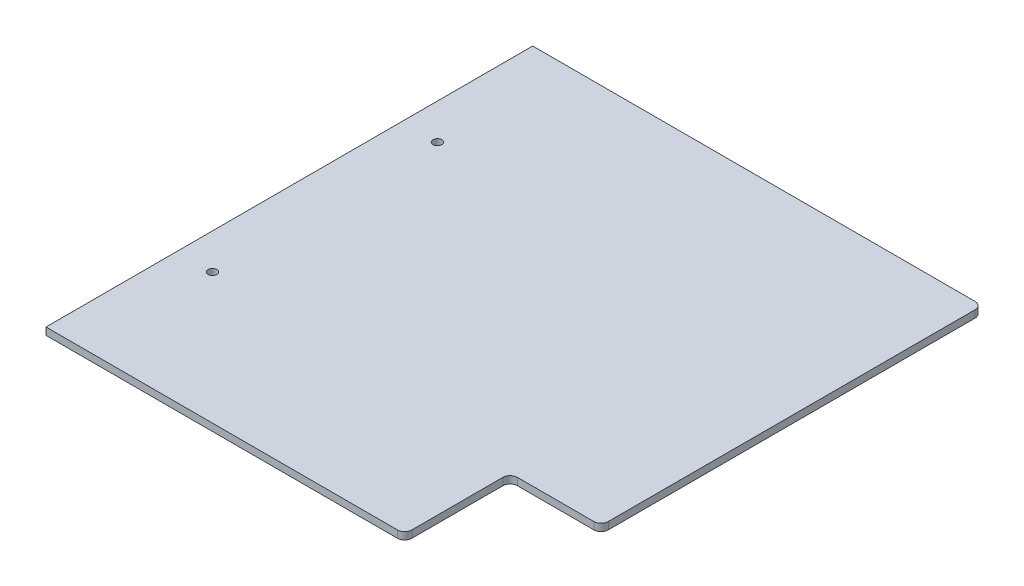
ISO-10303-21;
HEADER;
FILE_DESCRIPTION(('STEP AP214'),'2;1');
FILE_NAME('part.step','',(''),(''),'','','');
FILE_SCHEMA(('AUTOMOTIVE_DESIGN { 1 0 10303 214 1 1 1 1 }'));
ENDSEC;
DATA;
#1=APPLICATION_CONTEXT('core data for automotive mechanical design processes');
#2=APPLICATION_PROTOCOL_DEFINITION('international standard','automotive_design',2000,#1);
#3=PRODUCT_CONTEXT('',#1,'mechanical');
#4=PRODUCT('Part','Part','',(#3));
#5=PRODUCT_RELATED_PRODUCT_CATEGORY('part','',(#4));
#6=PRODUCT_DEFINITION_FORMATION('','',#4);
#7=PRODUCT_DEFINITION_CONTEXT('part definition',#1,'design');
#8=PRODUCT_DEFINITION('design','',#6,#7);
#9=PRODUCT_DEFINITION_SHAPE('','',#8);
#10=(LENGTH_UNIT() NAMED_UNIT(*) SI_UNIT(.MILLI.,.METRE.));
#11=(NAMED_UNIT(*) PLANE_ANGLE_UNIT() SI_UNIT($,.RADIAN.));
#12=(NAMED_UNIT(*) SI_UNIT($,.STERADIAN.) SOLID_ANGLE_UNIT());
#13=UNCERTAINTY_MEASURE_WITH_UNIT(LENGTH_MEASURE(1.E-05),#10,'distance_accuracy_value','');
#14=(GEOMETRIC_REPRESENTATION_CONTEXT(3) GLOBAL_UNCERTAINTY_ASSIGNED_CONTEXT((#13)) GLOBAL_UNIT_ASSIGNED_CONTEXT((#10,
#11,#12)) REPRESENTATION_CONTEXT('',''));
#15=CARTESIAN_POINT('',(0.,0.,0.));
#16=DIRECTION('',(0.,0.,1.));
#17=DIRECTION('',(1.,0.,0.));
#18=AXIS2_PLACEMENT_3D('',#15,#16,#17);
#19=CARTESIAN_POINT('',(0.,5.,0.));
#20=DIRECTION('',(0.,-1.,0.));
#21=DIRECTION('',(0.,0.,-1.));
#22=AXIS2_PLACEMENT_3D('',#19,#20,#21);
#23=PLANE('',#22);
#24=CARTESIAN_POINT('',(-93.2768482490273,5.,-44.9280155642024));
#25=DIRECTION('',(0.,1.,0.));
#26=DIRECTION('',(0.,0.,1.));
#27=AXIS2_PLACEMENT_3D('',#24,#25,#26);
#28=CIRCLE('',#27,3.00000000000001);
#29=CARTESIAN_POINT('',(-93.2768482490273,5.,-41.9280155642024));
#30=VERTEX_POINT('',#29);
#31=EDGE_CURVE('E148',#30,#30,#28,.T.);
#32=ORIENTED_EDGE('',*,*,#31,.F.);
#33=EDGE_LOOP('',(#32));
#34=FACE_BOUND('',#33,.T.);
#35=DIRECTION('',(1.,0.,0.));
#36=VECTOR('',#35,1.);
#37=CARTESIAN_POINT('',(-117.776848249027,5.,199.571984435798));
#38=LINE('',#37,#36);
#39=CARTESIAN_POINT('',(-117.776848249027,5.,199.571984435798));
#40=VERTEX_POINT('',#39);
#41=CARTESIAN_POINT('',(123.723151750973,5.,199.571984435798));
#42=VERTEX_POINT('',#41);
#43=EDGE_CURVE('E136',#40,#42,#38,.T.);
#44=ORIENTED_EDGE('',*,*,#43,.T.);
#45=CARTESIAN_POINT('',(123.723151750973,5.,194.571984435798));
#46=DIRECTION('',(0.,-1.,0.));
#47=DIRECTION('',(0.,0.,-1.));
#48=AXIS2_PLACEMENT_3D('',#45,#46,#47);
#49=CIRCLE('',#48,5.);
#50=CARTESIAN_POINT('',(128.723151750973,5.,194.571984435798));
#51=VERTEX_POINT('',#50);
#52=EDGE_CURVE('E176',#42,#51,#49,.F.);
#53=ORIENTED_EDGE('',*,*,#52,.T.);
#54=DIRECTION('',(0.,0.,-1.));
#55=VECTOR('',#54,1.);
#56=CARTESIAN_POINT('',(128.723151750973,5.,127.071984435798));
#57=LINE('',#56,#55);
#58=CARTESIAN_POINT('',(128.723151750973,5.,132.071984435798));
#59=VERTEX_POINT('',#58);
#60=EDGE_CURVE('E138',#51,#59,#57,.T.);
#61=ORIENTED_EDGE('',*,*,#60,.T.);
#62=CARTESIAN_POINT('',(133.723151750973,5.,132.071984435798));
#63=DIRECTION('',(0.,-1.,0.));
#64=DIRECTION('',(0.,0.,-1.));
#65=AXIS2_PLACEMENT_3D('',#62,#63,#64);
#66=CIRCLE('',#65,5.);
#67=CARTESIAN_POINT('',(133.723151750973,5.,127.071984435798));
#68=VERTEX_POINT('',#67);
#69=EDGE_CURVE('E11',#59,#68,#66,.T.);
#70=ORIENTED_EDGE('',*,*,#69,.T.);
#71=DIRECTION('',(1.,0.,0.));
#72=VECTOR('',#71,1.);
#73=CARTESIAN_POINT('',(191.223151750973,5.,127.071984435798));
#74=LINE('',#73,#72);
#75=CARTESIAN_POINT('',(186.223151750973,5.,127.071984435798));
#76=VERTEX_POINT('',#75);
#77=EDGE_CURVE('E143',#68,#76,#74,.T.);
#78=ORIENTED_EDGE('',*,*,#77,.T.);
#79=CARTESIAN_POINT('',(186.223151750973,5.,122.071984435798));
#80=DIRECTION('',(0.,-1.,0.));
#81=DIRECTION('',(0.,0.,-1.));
#82=AXIS2_PLACEMENT_3D('',#79,#80,#81);
#83=CIRCLE('',#82,5.);
#84=CARTESIAN_POINT('',(191.223151750973,5.,122.071984435798));
#85=VERTEX_POINT('',#84);
#86=EDGE_CURVE('E174',#76,#85,#83,.F.);
#87=ORIENTED_EDGE('',*,*,#86,.T.);
#88=DIRECTION('',(0.,0.,-1.));
#89=VECTOR('',#88,1.);
#90=CARTESIAN_POINT('',(191.223151750973,5.,127.071984435798));
#91=LINE('',#90,#89);
#92=CARTESIAN_POINT('',(191.223151750973,5.,-129.928015564202));
#93=VERTEX_POINT('',#92);
#94=EDGE_CURVE('E121',#85,#93,#91,.T.);
#95=ORIENTED_EDGE('',*,*,#94,.T.);
#96=CARTESIAN_POINT('',(186.223151750973,5.,-129.928015564202));
#97=DIRECTION('',(0.,-1.,0.));
#98=DIRECTION('',(0.,0.,-1.));
#99=AXIS2_PLACEMENT_3D('',#96,#97,#98);
#100=CIRCLE('',#99,5.);
#101=CARTESIAN_POINT('',(186.223151750973,5.,-134.928015564202));
#102=VERTEX_POINT('',#101);
#103=EDGE_CURVE('E117',#93,#102,#100,.F.);
#104=ORIENTED_EDGE('',*,*,#103,.T.);
#105=DIRECTION('',(-1.,0.,0.));
#106=VECTOR('',#105,1.);
#107=CARTESIAN_POINT('',(-117.776848249027,5.,-134.928015564202));
#108=LINE('',#107,#106);
#109=CARTESIAN_POINT('',(-117.776848249027,5.,-134.928015564202));
#110=VERTEX_POINT('',#109);
#111=EDGE_CURVE('E108',#102,#110,#108,.T.);
#112=ORIENTED_EDGE('',*,*,#111,.T.);
#113=DIRECTION('',(0.,0.,1.));
#114=VECTOR('',#113,1.);
#115=CARTESIAN_POINT('',(-117.776848249027,5.,199.571984435798));
#116=LINE('',#115,#114);
#117=EDGE_CURVE('E113',#110,#40,#116,.T.);
#118=ORIENTED_EDGE('',*,*,#117,.T.);
#119=EDGE_LOOP('',(#44,#53,#61,#70,#78,#87,#95,#104,#112,#118));
#120=FACE_BOUND('',#119,.T.);
#121=CARTESIAN_POINT('',(-93.2768482490273,5.,109.571984435798));
#122=DIRECTION('',(0.,1.,0.));
#123=DIRECTION('',(0.,0.,1.));
#124=AXIS2_PLACEMENT_3D('',#121,#122,#123);
#125=CIRCLE('',#124,3.00000000000001);
#126=CARTESIAN_POINT('',(-93.2768482490273,5.,112.571984435798));
#127=VERTEX_POINT('',#126);
#128=EDGE_CURVE('E216',#127,#127,#125,.T.);
#129=ORIENTED_EDGE('',*,*,#128,.F.);
#130=EDGE_LOOP('',(#129));
#131=FACE_BOUND('',#130,.T.);
#132=ADVANCED_FACE('F33',(#34,#120,#131),#23,.F.);
#133=CARTESIAN_POINT('',(0.,0.,0.));
#134=DIRECTION('',(0.,-1.,0.));
#135=DIRECTION('',(0.,0.,-1.));
#136=AXIS2_PLACEMENT_3D('',#133,#134,#135);
#137=PLANE('',#136);
#138=CARTESIAN_POINT('',(-93.2768482490273,0.,-44.9280155642024));
#139=DIRECTION('',(0.,1.,0.));
#140=DIRECTION('',(0.,0.,1.));
#141=AXIS2_PLACEMENT_3D('',#138,#139,#140);
#142=CIRCLE('',#141,3.00000000000001);
#143=CARTESIAN_POINT('',(-93.2768482490273,0.,-41.9280155642024));
#144=VERTEX_POINT('',#143);
#145=EDGE_CURVE('E213',#144,#144,#142,.T.);
#146=ORIENTED_EDGE('',*,*,#145,.T.);
#147=EDGE_LOOP('',(#146));
#148=FACE_BOUND('',#147,.T.);
#149=DIRECTION('',(0.,0.,-1.));
#150=VECTOR('',#149,1.);
#151=CARTESIAN_POINT('',(128.723151750973,0.,127.071984435798));
#152=LINE('',#151,#150);
#153=CARTESIAN_POINT('',(128.723151750973,0.,194.571984435798));
#154=VERTEX_POINT('',#153);
#155=CARTESIAN_POINT('',(128.723151750973,0.,132.071984435798));
#156=VERTEX_POINT('',#155);
#157=EDGE_CURVE('E155',#154,#156,#152,.T.);
#158=ORIENTED_EDGE('',*,*,#157,.F.);
#159=CARTESIAN_POINT('',(123.723151750973,0.,194.571984435798));
#160=DIRECTION('',(0.,-1.,0.));
#161=DIRECTION('',(0.,0.,-1.));
#162=AXIS2_PLACEMENT_3D('',#159,#160,#161);
#163=CIRCLE('',#162,5.);
#164=CARTESIAN_POINT('',(123.723151750973,0.,199.571984435798));
#165=VERTEX_POINT('',#164);
#166=EDGE_CURVE('E169',#154,#165,#163,.T.);
#167=ORIENTED_EDGE('',*,*,#166,.T.);
#168=DIRECTION('',(1.,0.,0.));
#169=VECTOR('',#168,1.);
#170=CARTESIAN_POINT('',(-117.776848249027,0.,199.571984435798));
#171=LINE('',#170,#169);
#172=CARTESIAN_POINT('',(-117.776848249027,0.,199.571984435798));
#173=VERTEX_POINT('',#172);
#174=EDGE_CURVE('E152',#173,#165,#171,.T.);
#175=ORIENTED_EDGE('',*,*,#174,.F.);
#176=DIRECTION('',(0.,0.,1.));
#177=VECTOR('',#176,1.);
#178=CARTESIAN_POINT('',(-117.776848249027,0.,199.571984435798));
#179=LINE('',#178,#177);
#180=CARTESIAN_POINT('',(-117.776848249027,0.,-134.928015564202));
#181=VERTEX_POINT('',#180);
#182=EDGE_CURVE('E150',#181,#173,#179,.T.);
#183=ORIENTED_EDGE('',*,*,#182,.F.);
#184=DIRECTION('',(-1.,0.,0.));
#185=VECTOR('',#184,1.);
#186=CARTESIAN_POINT('',(-117.776848249027,0.,-134.928015564202));
#187=LINE('',#186,#185);
#188=CARTESIAN_POINT('',(186.223151750973,0.,-134.928015564202));
#189=VERTEX_POINT('',#188);
#190=EDGE_CURVE('E127',#189,#181,#187,.T.);
#191=ORIENTED_EDGE('',*,*,#190,.F.);
#192=CARTESIAN_POINT('',(186.223151750973,0.,-129.928015564202));
#193=DIRECTION('',(0.,-1.,0.));
#194=DIRECTION('',(0.,0.,-1.));
#195=AXIS2_PLACEMENT_3D('',#192,#193,#194);
#196=CIRCLE('',#195,5.);
#197=CARTESIAN_POINT('',(191.223151750973,0.,-129.928015564202));
#198=VERTEX_POINT('',#197);
#199=EDGE_CURVE('E165',#189,#198,#196,.T.);
#200=ORIENTED_EDGE('',*,*,#199,.T.);
#201=DIRECTION('',(0.,0.,-1.));
#202=VECTOR('',#201,1.);
#203=CARTESIAN_POINT('',(191.223151750973,0.,127.071984435798));
#204=LINE('',#203,#202);
#205=CARTESIAN_POINT('',(191.223151750973,0.,122.071984435798));
#206=VERTEX_POINT('',#205);
#207=EDGE_CURVE('E145',#206,#198,#204,.T.);
#208=ORIENTED_EDGE('',*,*,#207,.F.);
#209=CARTESIAN_POINT('',(186.223151750973,0.,122.071984435798));
#210=DIRECTION('',(0.,-1.,0.));
#211=DIRECTION('',(0.,0.,-1.));
#212=AXIS2_PLACEMENT_3D('',#209,#210,#211);
#213=CIRCLE('',#212,5.);
#214=CARTESIAN_POINT('',(186.223151750973,0.,127.071984435798));
#215=VERTEX_POINT('',#214);
#216=EDGE_CURVE('E167',#206,#215,#213,.T.);
#217=ORIENTED_EDGE('',*,*,#216,.T.);
#218=DIRECTION('',(1.,0.,0.));
#219=VECTOR('',#218,1.);
#220=CARTESIAN_POINT('',(191.223151750973,0.,127.071984435798));
#221=LINE('',#220,#219);
#222=CARTESIAN_POINT('',(133.723151750973,0.,127.071984435798));
#223=VERTEX_POINT('',#222);
#224=EDGE_CURVE('E158',#223,#215,#221,.T.);
#225=ORIENTED_EDGE('',*,*,#224,.F.);
#226=CARTESIAN_POINT('',(133.723151750973,0.,132.071984435798));
#227=DIRECTION('',(0.,-1.,0.));
#228=DIRECTION('',(0.,0.,-1.));
#229=AXIS2_PLACEMENT_3D('',#226,#227,#228);
#230=CIRCLE('',#229,5.);
#231=EDGE_CURVE('E41',#223,#156,#230,.F.);
#232=ORIENTED_EDGE('',*,*,#231,.T.);
#233=EDGE_LOOP('',(#158,#167,#175,#183,#191,#200,#208,#217,#225,#232));
#234=FACE_BOUND('',#233,.T.);
#235=CARTESIAN_POINT('',(-93.2768482490273,0.,109.571984435798));
#236=DIRECTION('',(0.,1.,0.));
#237=DIRECTION('',(0.,0.,1.));
#238=AXIS2_PLACEMENT_3D('',#235,#236,#237);
#239=CIRCLE('',#238,3.00000000000001);
#240=CARTESIAN_POINT('',(-93.2768482490273,0.,112.571984435798));
#241=VERTEX_POINT('',#240);
#242=EDGE_CURVE('E219',#241,#241,#239,.T.);
#243=ORIENTED_EDGE('',*,*,#242,.T.);
#244=EDGE_LOOP('',(#243));
#245=FACE_BOUND('',#244,.T.);
#246=ADVANCED_FACE('F191',(#148,#234,#245),#137,.T.);
#247=CARTESIAN_POINT('',(191.223151750973,5.,127.071984435798));
#248=DIRECTION('',(-1.,0.,0.));
#249=DIRECTION('',(0.,0.,1.));
#250=AXIS2_PLACEMENT_3D('',#247,#248,#249);
#251=PLANE('',#250);
#252=ORIENTED_EDGE('',*,*,#94,.F.);
#253=DIRECTION('',(0.,-1.,0.));
#254=VECTOR('',#253,1.);
#255=CARTESIAN_POINT('',(191.223151750973,5.,122.071984435798));
#256=LINE('',#255,#254);
#257=EDGE_CURVE('E184',#85,#206,#256,.T.);
#258=ORIENTED_EDGE('',*,*,#257,.T.);
#259=ORIENTED_EDGE('',*,*,#207,.T.);
#260=DIRECTION('',(0.,-1.,0.));
#261=VECTOR('',#260,1.);
#262=CARTESIAN_POINT('',(191.223151750973,5.,-129.928015564202));
#263=LINE('',#262,#261);
#264=EDGE_CURVE('E182',#198,#93,#263,.F.);
#265=ORIENTED_EDGE('',*,*,#264,.T.);
#266=EDGE_LOOP('',(#252,#258,#259,#265));
#267=FACE_BOUND('',#266,.T.);
#268=ADVANCED_FACE('F209',(#267),#251,.F.);
#269=CARTESIAN_POINT('',(-117.776848249027,5.,-134.928015564202));
#270=DIRECTION('',(0.,0.,1.));
#271=DIRECTION('',(1.,0.,0.));
#272=AXIS2_PLACEMENT_3D('',#269,#270,#271);
#273=PLANE('',#272);
#274=ORIENTED_EDGE('',*,*,#111,.F.);
#275=DIRECTION('',(0.,-1.,0.));
#276=VECTOR('',#275,1.);
#277=CARTESIAN_POINT('',(186.223151750973,5.,-134.928015564202));
#278=LINE('',#277,#276);
#279=EDGE_CURVE('E187',#102,#189,#278,.T.);
#280=ORIENTED_EDGE('',*,*,#279,.T.);
#281=ORIENTED_EDGE('',*,*,#190,.T.);
#282=DIRECTION('',(0.,-1.,0.));
#283=VECTOR('',#282,1.);
#284=CARTESIAN_POINT('',(-117.776848249027,5.,-134.928015564202));
#285=LINE('',#284,#283);
#286=EDGE_CURVE('E124',#110,#181,#285,.T.);
#287=ORIENTED_EDGE('',*,*,#286,.F.);
#288=EDGE_LOOP('',(#274,#280,#281,#287));
#289=FACE_BOUND('',#288,.T.);
#290=ADVANCED_FACE('F125',(#289),#273,.F.);
#291=CARTESIAN_POINT('',(-117.776848249027,5.,199.571984435798));
#292=DIRECTION('',(1.,0.,0.));
#293=DIRECTION('',(0.,0.,-1.));
#294=AXIS2_PLACEMENT_3D('',#291,#292,#293);
#295=PLANE('',#294);
#296=ORIENTED_EDGE('',*,*,#182,.T.);
#297=DIRECTION('',(0.,-1.,0.));
#298=VECTOR('',#297,1.);
#299=CARTESIAN_POINT('',(-117.776848249027,5.,199.571984435798));
#300=LINE('',#299,#298);
#301=EDGE_CURVE('E131',#40,#173,#300,.T.);
#302=ORIENTED_EDGE('',*,*,#301,.F.);
#303=ORIENTED_EDGE('',*,*,#117,.F.);
#304=ORIENTED_EDGE('',*,*,#286,.T.);
#305=EDGE_LOOP('',(#296,#302,#303,#304));
#306=FACE_BOUND('',#305,.T.);
#307=ADVANCED_FACE('F133',(#306),#295,.F.);
#308=CARTESIAN_POINT('',(-117.776848249027,5.,199.571984435798));
#309=DIRECTION('',(0.,0.,-1.));
#310=DIRECTION('',(-1.,0.,0.));
#311=AXIS2_PLACEMENT_3D('',#308,#309,#310);
#312=PLANE('',#311);
#313=ORIENTED_EDGE('',*,*,#174,.T.);
#314=DIRECTION('',(0.,-1.,0.));
#315=VECTOR('',#314,1.);
#316=CARTESIAN_POINT('',(123.723151750973,5.,199.571984435798));
#317=LINE('',#316,#315);
#318=EDGE_CURVE('E171',#165,#42,#317,.F.);
#319=ORIENTED_EDGE('',*,*,#318,.T.);
#320=ORIENTED_EDGE('',*,*,#43,.F.);
#321=ORIENTED_EDGE('',*,*,#301,.T.);
#322=EDGE_LOOP('',(#313,#319,#320,#321));
#323=FACE_BOUND('',#322,.T.);
#324=ADVANCED_FACE('F244',(#323),#312,.F.);
#325=CARTESIAN_POINT('',(128.723151750973,5.,127.071984435798));
#326=DIRECTION('',(-1.,0.,0.));
#327=DIRECTION('',(0.,0.,1.));
#328=AXIS2_PLACEMENT_3D('',#325,#326,#327);
#329=PLANE('',#328);
#330=ORIENTED_EDGE('',*,*,#60,.F.);
#331=DIRECTION('',(0.,-1.,0.));
#332=VECTOR('',#331,1.);
#333=CARTESIAN_POINT('',(128.723151750973,5.,194.571984435798));
#334=LINE('',#333,#332);
#335=EDGE_CURVE('E162',#51,#154,#334,.T.);
#336=ORIENTED_EDGE('',*,*,#335,.T.);
#337=ORIENTED_EDGE('',*,*,#157,.T.);
#338=DIRECTION('',(0.,-1.,0.));
#339=VECTOR('',#338,1.);
#340=CARTESIAN_POINT('',(128.723151750973,5.,132.071984435798));
#341=LINE('',#340,#339);
#342=EDGE_CURVE('E130',#156,#59,#341,.F.);
#343=ORIENTED_EDGE('',*,*,#342,.T.);
#344=EDGE_LOOP('',(#330,#336,#337,#343));
#345=FACE_BOUND('',#344,.T.);
#346=ADVANCED_FACE('F198',(#345),#329,.F.);
#347=CARTESIAN_POINT('',(191.223151750973,5.,127.071984435798));
#348=DIRECTION('',(0.,0.,-1.));
#349=DIRECTION('',(-1.,0.,0.));
#350=AXIS2_PLACEMENT_3D('',#347,#348,#349);
#351=PLANE('',#350);
#352=ORIENTED_EDGE('',*,*,#77,.F.);
#353=DIRECTION('',(0.,-1.,0.));
#354=VECTOR('',#353,1.);
#355=CARTESIAN_POINT('',(133.723151750973,0.,127.071984435798));
#356=LINE('',#355,#354);
#357=EDGE_CURVE('E179',#68,#223,#356,.T.);
#358=ORIENTED_EDGE('',*,*,#357,.T.);
#359=ORIENTED_EDGE('',*,*,#224,.T.);
#360=DIRECTION('',(0.,-1.,0.));
#361=VECTOR('',#360,1.);
#362=CARTESIAN_POINT('',(186.223151750973,5.,127.071984435798));
#363=LINE('',#362,#361);
#364=EDGE_CURVE('E48',#215,#76,#363,.F.);
#365=ORIENTED_EDGE('',*,*,#364,.T.);
#366=EDGE_LOOP('',(#352,#358,#359,#365));
#367=FACE_BOUND('',#366,.T.);
#368=ADVANCED_FACE('F201',(#367),#351,.F.);
#369=CARTESIAN_POINT('',(-93.2768482490273,5.,-44.9280155642024));
#370=DIRECTION('',(0.,-1.,0.));
#371=DIRECTION('',(0.,0.,-1.));
#372=AXIS2_PLACEMENT_3D('',#369,#370,#371);
#373=CYLINDRICAL_SURFACE('',#372,3.00000000000001);
#374=ORIENTED_EDGE('',*,*,#31,.T.);
#375=EDGE_LOOP('',(#374));
#376=FACE_BOUND('',#375,.T.);
#377=ORIENTED_EDGE('',*,*,#145,.F.);
#378=EDGE_LOOP('',(#377));
#379=FACE_BOUND('',#378,.T.);
#380=ADVANCED_FACE('F237',(#376,#379),#373,.F.);
#381=CARTESIAN_POINT('',(-93.2768482490273,5.,109.571984435798));
#382=DIRECTION('',(0.,-1.,0.));
#383=DIRECTION('',(0.,0.,-1.));
#384=AXIS2_PLACEMENT_3D('',#381,#382,#383);
#385=CYLINDRICAL_SURFACE('',#384,3.00000000000001);
#386=ORIENTED_EDGE('',*,*,#128,.T.);
#387=EDGE_LOOP('',(#386));
#388=FACE_BOUND('',#387,.T.);
#389=ORIENTED_EDGE('',*,*,#242,.F.);
#390=EDGE_LOOP('',(#389));
#391=FACE_BOUND('',#390,.T.);
#392=ADVANCED_FACE('F225',(#388,#391),#385,.F.);
#393=CARTESIAN_POINT('',(123.723151750973,5.,194.571984435798));
#394=DIRECTION('',(0.,-1.,0.));
#395=DIRECTION('',(0.,0.,-1.));
#396=AXIS2_PLACEMENT_3D('',#393,#394,#395);
#397=CYLINDRICAL_SURFACE('',#396,5.);
#398=ORIENTED_EDGE('',*,*,#52,.F.);
#399=ORIENTED_EDGE('',*,*,#318,.F.);
#400=ORIENTED_EDGE('',*,*,#166,.F.);
#401=ORIENTED_EDGE('',*,*,#335,.F.);
#402=EDGE_LOOP('',(#398,#399,#400,#401));
#403=FACE_BOUND('',#402,.T.);
#404=ADVANCED_FACE('F254',(#403),#397,.T.);
#405=CARTESIAN_POINT('',(133.723151750973,5.,132.071984435798));
#406=DIRECTION('',(0.,1.,0.));
#407=DIRECTION('',(0.,0.,1.));
#408=AXIS2_PLACEMENT_3D('',#405,#406,#407);
#409=CYLINDRICAL_SURFACE('',#408,5.);
#410=ORIENTED_EDGE('',*,*,#69,.F.);
#411=ORIENTED_EDGE('',*,*,#342,.F.);
#412=ORIENTED_EDGE('',*,*,#231,.F.);
#413=ORIENTED_EDGE('',*,*,#357,.F.);
#414=EDGE_LOOP('',(#410,#411,#412,#413));
#415=FACE_BOUND('',#414,.T.);
#416=ADVANCED_FACE('F200',(#415),#409,.F.);
#417=CARTESIAN_POINT('',(186.223151750973,5.,122.071984435798));
#418=DIRECTION('',(0.,-1.,0.));
#419=DIRECTION('',(0.,0.,-1.));
#420=AXIS2_PLACEMENT_3D('',#417,#418,#419);
#421=CYLINDRICAL_SURFACE('',#420,5.);
#422=ORIENTED_EDGE('',*,*,#86,.F.);
#423=ORIENTED_EDGE('',*,*,#364,.F.);
#424=ORIENTED_EDGE('',*,*,#216,.F.);
#425=ORIENTED_EDGE('',*,*,#257,.F.);
#426=EDGE_LOOP('',(#422,#423,#424,#425));
#427=FACE_BOUND('',#426,.T.);
#428=ADVANCED_FACE('F206',(#427),#421,.T.);
#429=CARTESIAN_POINT('',(186.223151750973,5.,-129.928015564202));
#430=DIRECTION('',(0.,-1.,0.));
#431=DIRECTION('',(0.,0.,-1.));
#432=AXIS2_PLACEMENT_3D('',#429,#430,#431);
#433=CYLINDRICAL_SURFACE('',#432,5.);
#434=ORIENTED_EDGE('',*,*,#103,.F.);
#435=ORIENTED_EDGE('',*,*,#264,.F.);
#436=ORIENTED_EDGE('',*,*,#199,.F.);
#437=ORIENTED_EDGE('',*,*,#279,.F.);
#438=EDGE_LOOP('',(#434,#435,#436,#437));
#439=FACE_BOUND('',#438,.T.);
#440=ADVANCED_FACE('F35',(#439),#433,.T.);
#441=CLOSED_SHELL('',(#132,#246,#268,#290,#307,#324,#346,#368,#380,#392,#404,#416,#428,#440));
#442=MANIFOLD_SOLID_BREP('B2',#441);
#443=ADVANCED_BREP_SHAPE_REPRESENTATION('',(#18,#442),#14);
#444=SHAPE_DEFINITION_REPRESENTATION(#9,#443);
ENDSEC;
END-ISO-10303-21;
